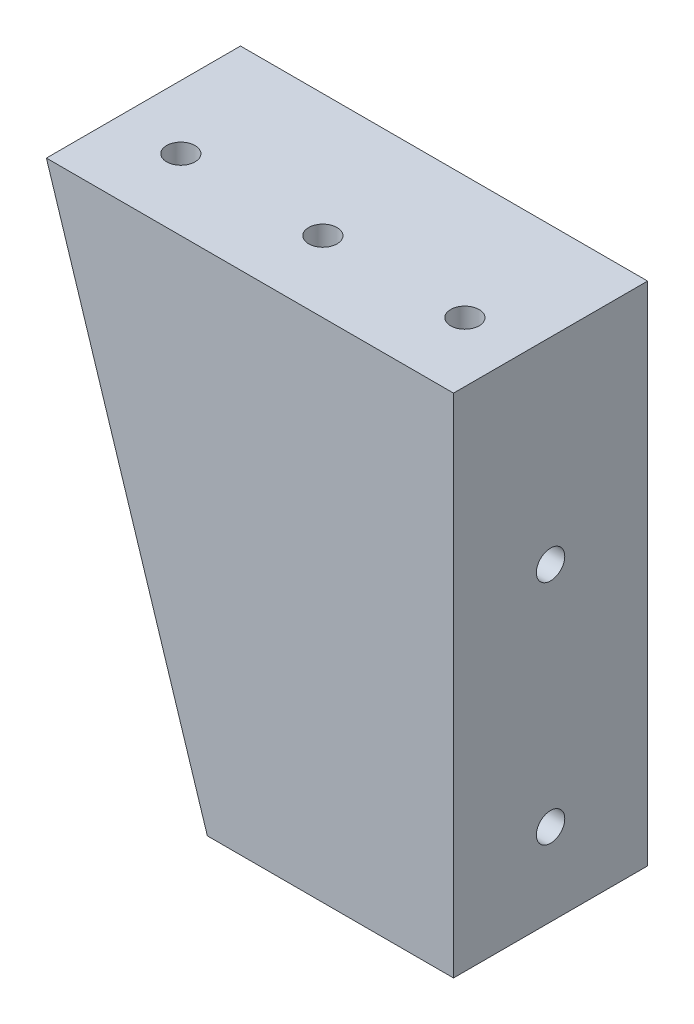
ISO-10303-21;
HEADER;
FILE_DESCRIPTION(('STEP AP214'),'2;1');
FILE_NAME('part.step','',(''),(''),'','','');
FILE_SCHEMA(('AUTOMOTIVE_DESIGN { 1 0 10303 214 1 1 1 1 }'));
ENDSEC;
DATA;
#1=APPLICATION_CONTEXT('core data for automotive mechanical design processes');
#2=APPLICATION_PROTOCOL_DEFINITION('international standard','automotive_design',2000,#1);
#3=PRODUCT_CONTEXT('',#1,'mechanical');
#4=PRODUCT('Part','Part','',(#3));
#5=PRODUCT_RELATED_PRODUCT_CATEGORY('part','',(#4));
#6=PRODUCT_DEFINITION_FORMATION('','',#4);
#7=PRODUCT_DEFINITION_CONTEXT('part definition',#1,'design');
#8=PRODUCT_DEFINITION('design','',#6,#7);
#9=PRODUCT_DEFINITION_SHAPE('','',#8);
#10=(LENGTH_UNIT() NAMED_UNIT(*) SI_UNIT(.MILLI.,.METRE.));
#11=(NAMED_UNIT(*) PLANE_ANGLE_UNIT() SI_UNIT($,.RADIAN.));
#12=(NAMED_UNIT(*) SI_UNIT($,.STERADIAN.) SOLID_ANGLE_UNIT());
#13=UNCERTAINTY_MEASURE_WITH_UNIT(LENGTH_MEASURE(1.E-05),#10,'distance_accuracy_value','');
#14=(GEOMETRIC_REPRESENTATION_CONTEXT(3) GLOBAL_UNCERTAINTY_ASSIGNED_CONTEXT((#13)) GLOBAL_UNIT_ASSIGNED_CONTEXT((#10,
#11,#12)) REPRESENTATION_CONTEXT('',''));
#15=CARTESIAN_POINT('',(0.,0.,0.));
#16=DIRECTION('',(0.,0.,1.));
#17=DIRECTION('',(1.,0.,0.));
#18=AXIS2_PLACEMENT_3D('',#15,#16,#17);
#19=CARTESIAN_POINT('',(371.583669076626,-84.0481083425104,-9.00000000000001));
#20=DIRECTION('',(-1.,0.,0.));
#21=DIRECTION('',(0.,0.,1.));
#22=AXIS2_PLACEMENT_3D('',#19,#20,#21);
#23=PLANE('',#22);
#24=DIRECTION('',(0.,-1.,0.));
#25=VECTOR('',#24,1.);
#26=CARTESIAN_POINT('',(371.583669076626,-84.0481083425104,10.8));
#27=LINE('',#26,#25);
#28=CARTESIAN_POINT('',(371.583669076626,-84.0481083425104,10.8));
#29=VERTEX_POINT('',#28);
#30=CARTESIAN_POINT('',(371.583669076626,-86.4481083425104,10.8));
#31=VERTEX_POINT('',#30);
#32=EDGE_CURVE('E159',#29,#31,#27,.T.);
#33=ORIENTED_EDGE('',*,*,#32,.T.);
#34=DIRECTION('',(0.,0.,1.));
#35=VECTOR('',#34,1.);
#36=CARTESIAN_POINT('',(371.583669076626,-86.4481083425104,-9.00000000000001));
#37=LINE('',#36,#35);
#38=CARTESIAN_POINT('',(371.583669076626,-86.4481083425104,-5.5));
#39=VERTEX_POINT('',#38);
#40=EDGE_CURVE('E145',#39,#31,#37,.T.);
#41=ORIENTED_EDGE('',*,*,#40,.F.);
#42=DIRECTION('',(0.,-1.,0.));
#43=VECTOR('',#42,1.);
#44=CARTESIAN_POINT('',(371.583669076626,0.,-5.5));
#45=LINE('',#44,#43);
#46=CARTESIAN_POINT('',(371.583669076626,-84.0481083425104,-5.5));
#47=VERTEX_POINT('',#46);
#48=EDGE_CURVE('E329',#47,#39,#45,.T.);
#49=ORIENTED_EDGE('',*,*,#48,.F.);
#50=DIRECTION('',(0.,0.,1.));
#51=VECTOR('',#50,1.);
#52=CARTESIAN_POINT('',(371.583669076626,-84.0481083425104,-9.00000000000001));
#53=LINE('',#52,#51);
#54=EDGE_CURVE('E160',#47,#29,#53,.T.);
#55=ORIENTED_EDGE('',*,*,#54,.T.);
#56=EDGE_LOOP('',(#33,#41,#49,#55));
#57=FACE_BOUND('',#56,.T.);
#58=ADVANCED_FACE('F53',(#57),#23,.F.);
#59=CARTESIAN_POINT('',(371.583669076626,-84.0481083425104,-9.00000000000001));
#60=DIRECTION('',(0.,1.,0.));
#61=DIRECTION('',(0.,0.,1.));
#62=AXIS2_PLACEMENT_3D('',#59,#60,#61);
#63=PLANE('',#62);
#64=CARTESIAN_POINT('',(374.406426849265,-84.0481083425104,7.5));
#65=DIRECTION('',(0.,1.,0.));
#66=DIRECTION('',(0.,0.,1.));
#67=AXIS2_PLACEMENT_3D('',#64,#65,#66);
#68=CIRCLE('',#67,1.50000000000002);
#69=CARTESIAN_POINT('',(374.406426849265,-84.0481083425104,9.00000000000002));
#70=VERTEX_POINT('',#69);
#71=EDGE_CURVE('E210',#70,#70,#68,.F.);
#72=ORIENTED_EDGE('',*,*,#71,.F.);
#73=EDGE_LOOP('',(#72));
#74=FACE_BOUND('',#73,.T.);
#75=DIRECTION('',(-1.,0.,0.));
#76=VECTOR('',#75,1.);
#77=CARTESIAN_POINT('',(371.583669076626,-84.0481083425104,10.8));
#78=LINE('',#77,#76);
#79=CARTESIAN_POINT('',(377.083669076626,-84.0481083425104,10.8));
#80=VERTEX_POINT('',#79);
#81=EDGE_CURVE('E69',#80,#29,#78,.T.);
#82=ORIENTED_EDGE('',*,*,#81,.T.);
#83=ORIENTED_EDGE('',*,*,#54,.F.);
#84=DIRECTION('',(-1.,0.,0.));
#85=VECTOR('',#84,1.);
#86=CARTESIAN_POINT('',(0.,-84.0481083425104,-5.5));
#87=LINE('',#86,#85);
#88=CARTESIAN_POINT('',(377.083669076626,-84.0481083425104,-5.5));
#89=VERTEX_POINT('',#88);
#90=EDGE_CURVE('E325',#89,#47,#87,.T.);
#91=ORIENTED_EDGE('',*,*,#90,.F.);
#92=DIRECTION('',(0.,0.,1.));
#93=VECTOR('',#92,1.);
#94=CARTESIAN_POINT('',(377.083669076626,-84.0481083425104,-9.00000000000001));
#95=LINE('',#94,#93);
#96=EDGE_CURVE('E202',#89,#80,#95,.T.);
#97=ORIENTED_EDGE('',*,*,#96,.T.);
#98=EDGE_LOOP('',(#82,#83,#91,#97));
#99=FACE_BOUND('',#98,.T.);
#100=ADVANCED_FACE('F378',(#74,#99),#63,.F.);
#101=CARTESIAN_POINT('',(377.083669076626,-84.0481083425104,-9.00000000000001));
#102=DIRECTION('',(1.,0.,0.));
#103=DIRECTION('',(0.,0.,-1.));
#104=AXIS2_PLACEMENT_3D('',#101,#102,#103);
#105=PLANE('',#104);
#106=DIRECTION('',(0.,1.,0.));
#107=VECTOR('',#106,1.);
#108=CARTESIAN_POINT('',(377.083669076626,-84.0481083425104,10.8));
#109=LINE('',#108,#107);
#110=CARTESIAN_POINT('',(377.083669076626,-86.4481083425104,10.8));
#111=VERTEX_POINT('',#110);
#112=EDGE_CURVE('E77',#111,#80,#109,.T.);
#113=ORIENTED_EDGE('',*,*,#112,.T.);
#114=ORIENTED_EDGE('',*,*,#96,.F.);
#115=DIRECTION('',(0.,1.,0.));
#116=VECTOR('',#115,1.);
#117=CARTESIAN_POINT('',(377.083669076626,0.,-5.5));
#118=LINE('',#117,#116);
#119=CARTESIAN_POINT('',(377.083669076626,-86.4481083425104,-5.5));
#120=VERTEX_POINT('',#119);
#121=EDGE_CURVE('E321',#120,#89,#118,.T.);
#122=ORIENTED_EDGE('',*,*,#121,.F.);
#123=DIRECTION('',(0.,0.,1.));
#124=VECTOR('',#123,1.);
#125=CARTESIAN_POINT('',(377.083669076626,-86.4481083425104,-9.00000000000001));
#126=LINE('',#125,#124);
#127=EDGE_CURVE('E156',#120,#111,#126,.T.);
#128=ORIENTED_EDGE('',*,*,#127,.T.);
#129=EDGE_LOOP('',(#113,#114,#122,#128));
#130=FACE_BOUND('',#129,.T.);
#131=ADVANCED_FACE('F383',(#130),#105,.F.);
#132=CARTESIAN_POINT('',(371.583669076626,-86.4481083425104,-9.00000000000001));
#133=DIRECTION('',(0.,-1.,0.));
#134=DIRECTION('',(0.,0.,-1.));
#135=AXIS2_PLACEMENT_3D('',#132,#133,#134);
#136=PLANE('',#135);
#137=CARTESIAN_POINT('',(374.406426849265,-86.4481083425104,7.5));
#138=DIRECTION('',(0.,-1.,0.));
#139=DIRECTION('',(0.,0.,-1.));
#140=AXIS2_PLACEMENT_3D('',#137,#138,#139);
#141=CIRCLE('',#140,1.50000000000002);
#142=CARTESIAN_POINT('',(374.406426849265,-86.4481083425104,5.99999999999998));
#143=VERTEX_POINT('',#142);
#144=EDGE_CURVE('E189',#143,#143,#141,.F.);
#145=ORIENTED_EDGE('',*,*,#144,.F.);
#146=EDGE_LOOP('',(#145));
#147=FACE_BOUND('',#146,.T.);
#148=DIRECTION('',(1.,0.,0.));
#149=VECTOR('',#148,1.);
#150=CARTESIAN_POINT('',(371.583669076626,-86.4481083425104,10.8));
#151=LINE('',#150,#149);
#152=EDGE_CURVE('E149',#31,#111,#151,.T.);
#153=ORIENTED_EDGE('',*,*,#152,.T.);
#154=ORIENTED_EDGE('',*,*,#127,.F.);
#155=DIRECTION('',(1.,0.,0.));
#156=VECTOR('',#155,1.);
#157=CARTESIAN_POINT('',(0.,-86.4481083425104,-5.5));
#158=LINE('',#157,#156);
#159=EDGE_CURVE('E151',#39,#120,#158,.T.);
#160=ORIENTED_EDGE('',*,*,#159,.F.);
#161=ORIENTED_EDGE('',*,*,#40,.T.);
#162=EDGE_LOOP('',(#153,#154,#160,#161));
#163=FACE_BOUND('',#162,.T.);
#164=ADVANCED_FACE('F147',(#147,#163),#136,.F.);
#165=CARTESIAN_POINT('',(356.512441298202,-84.0481083425104,-9.00000000000001));
#166=DIRECTION('',(-1.,0.,0.));
#167=DIRECTION('',(0.,0.,1.));
#168=AXIS2_PLACEMENT_3D('',#165,#166,#167);
#169=PLANE('',#168);
#170=DIRECTION('',(0.,-1.,0.));
#171=VECTOR('',#170,1.);
#172=CARTESIAN_POINT('',(356.512441298202,-84.0481083425104,10.8));
#173=LINE('',#172,#171);
#174=CARTESIAN_POINT('',(356.512441298202,-84.0481083425104,10.8));
#175=VERTEX_POINT('',#174);
#176=CARTESIAN_POINT('',(356.512441298202,-86.4481083425104,10.8));
#177=VERTEX_POINT('',#176);
#178=EDGE_CURVE('E172',#175,#177,#173,.T.);
#179=ORIENTED_EDGE('',*,*,#178,.T.);
#180=DIRECTION('',(0.,0.,1.));
#181=VECTOR('',#180,1.);
#182=CARTESIAN_POINT('',(356.512441298202,-86.4481083425104,-9.00000000000001));
#183=LINE('',#182,#181);
#184=CARTESIAN_POINT('',(356.512441298202,-86.4481083425104,-5.5));
#185=VERTEX_POINT('',#184);
#186=EDGE_CURVE('E155',#185,#177,#183,.T.);
#187=ORIENTED_EDGE('',*,*,#186,.F.);
#188=DIRECTION('',(0.,-1.,0.));
#189=VECTOR('',#188,1.);
#190=CARTESIAN_POINT('',(356.512441298202,0.,-5.5));
#191=LINE('',#190,#189);
#192=CARTESIAN_POINT('',(356.512441298202,-84.0481083425104,-5.5));
#193=VERTEX_POINT('',#192);
#194=EDGE_CURVE('E12',#193,#185,#191,.T.);
#195=ORIENTED_EDGE('',*,*,#194,.F.);
#196=DIRECTION('',(0.,0.,1.));
#197=VECTOR('',#196,1.);
#198=CARTESIAN_POINT('',(356.512441298202,-84.0481083425104,-9.00000000000001));
#199=LINE('',#198,#197);
#200=EDGE_CURVE('E185',#193,#175,#199,.T.);
#201=ORIENTED_EDGE('',*,*,#200,.T.);
#202=EDGE_LOOP('',(#179,#187,#195,#201));
#203=FACE_BOUND('',#202,.T.);
#204=ADVANCED_FACE('F358',(#203),#169,.F.);
#205=CARTESIAN_POINT('',(356.512441298202,-84.0481083425104,-9.00000000000001));
#206=DIRECTION('',(0.,1.,0.));
#207=DIRECTION('',(0.,0.,1.));
#208=AXIS2_PLACEMENT_3D('',#205,#206,#207);
#209=PLANE('',#208);
#210=CARTESIAN_POINT('',(359.406426849265,-84.0481083425104,7.5));
#211=DIRECTION('',(0.,1.,0.));
#212=DIRECTION('',(0.,0.,1.));
#213=AXIS2_PLACEMENT_3D('',#210,#211,#212);
#214=CIRCLE('',#213,1.50000000000002);
#215=CARTESIAN_POINT('',(359.406426849265,-84.0481083425104,9.00000000000002));
#216=VERTEX_POINT('',#215);
#217=EDGE_CURVE('E218',#216,#216,#214,.F.);
#218=ORIENTED_EDGE('',*,*,#217,.F.);
#219=EDGE_LOOP('',(#218));
#220=FACE_BOUND('',#219,.T.);
#221=DIRECTION('',(-1.,0.,0.));
#222=VECTOR('',#221,1.);
#223=CARTESIAN_POINT('',(356.512441298202,-84.0481083425104,10.8));
#224=LINE('',#223,#222);
#225=CARTESIAN_POINT('',(362.112441298202,-84.0481083425104,10.8));
#226=VERTEX_POINT('',#225);
#227=EDGE_CURVE('E182',#226,#175,#224,.T.);
#228=ORIENTED_EDGE('',*,*,#227,.T.);
#229=ORIENTED_EDGE('',*,*,#200,.F.);
#230=DIRECTION('',(-1.,0.,0.));
#231=VECTOR('',#230,1.);
#232=CARTESIAN_POINT('',(0.,-84.0481083425104,-5.5));
#233=LINE('',#232,#231);
#234=CARTESIAN_POINT('',(362.112441298202,-84.0481083425104,-5.5));
#235=VERTEX_POINT('',#234);
#236=EDGE_CURVE('E62',#235,#193,#233,.T.);
#237=ORIENTED_EDGE('',*,*,#236,.F.);
#238=DIRECTION('',(0.,0.,1.));
#239=VECTOR('',#238,1.);
#240=CARTESIAN_POINT('',(362.112441298202,-84.0481083425104,-9.00000000000001));
#241=LINE('',#240,#239);
#242=EDGE_CURVE('E190',#235,#226,#241,.T.);
#243=ORIENTED_EDGE('',*,*,#242,.T.);
#244=EDGE_LOOP('',(#228,#229,#237,#243));
#245=FACE_BOUND('',#244,.T.);
#246=ADVANCED_FACE('F348',(#220,#245),#209,.F.);
#247=CARTESIAN_POINT('',(362.112441298202,-84.0481083425104,-9.00000000000001));
#248=DIRECTION('',(1.,0.,0.));
#249=DIRECTION('',(0.,1.,0.));
#250=AXIS2_PLACEMENT_3D('',#247,#248,#249);
#251=PLANE('',#250);
#252=DIRECTION('',(0.,1.,0.));
#253=VECTOR('',#252,1.);
#254=CARTESIAN_POINT('',(362.112441298202,-84.0481083425104,10.8));
#255=LINE('',#254,#253);
#256=CARTESIAN_POINT('',(362.112441298202,-86.4481083425104,10.8));
#257=VERTEX_POINT('',#256);
#258=EDGE_CURVE('E179',#257,#226,#255,.T.);
#259=ORIENTED_EDGE('',*,*,#258,.T.);
#260=ORIENTED_EDGE('',*,*,#242,.F.);
#261=DIRECTION('',(0.,1.,0.));
#262=VECTOR('',#261,1.);
#263=CARTESIAN_POINT('',(362.112441298204,-8.37553270484362E-12,-5.5));
#264=LINE('',#263,#262);
#265=CARTESIAN_POINT('',(362.112441298202,-86.4481083425104,-5.5));
#266=VERTEX_POINT('',#265);
#267=EDGE_CURVE('E336',#266,#235,#264,.T.);
#268=ORIENTED_EDGE('',*,*,#267,.F.);
#269=DIRECTION('',(0.,0.,1.));
#270=VECTOR('',#269,1.);
#271=CARTESIAN_POINT('',(362.112441298202,-86.4481083425104,-9.00000000000001));
#272=LINE('',#271,#270);
#273=EDGE_CURVE('E194',#266,#257,#272,.T.);
#274=ORIENTED_EDGE('',*,*,#273,.T.);
#275=EDGE_LOOP('',(#259,#260,#268,#274));
#276=FACE_BOUND('',#275,.T.);
#277=ADVANCED_FACE('F351',(#276),#251,.F.);
#278=CARTESIAN_POINT('',(356.512441298202,-86.4481083425104,-9.00000000000001));
#279=DIRECTION('',(0.,-1.,0.));
#280=DIRECTION('',(1.,0.,0.));
#281=AXIS2_PLACEMENT_3D('',#278,#279,#280);
#282=PLANE('',#281);
#283=CARTESIAN_POINT('',(359.406426849265,-86.4481083425104,7.5));
#284=DIRECTION('',(0.,-1.,0.));
#285=DIRECTION('',(1.,0.,0.));
#286=AXIS2_PLACEMENT_3D('',#283,#284,#285);
#287=CIRCLE('',#286,1.50000000000002);
#288=CARTESIAN_POINT('',(360.906426849265,-86.4481083425104,7.5));
#289=VERTEX_POINT('',#288);
#290=EDGE_CURVE('E214',#289,#289,#287,.F.);
#291=ORIENTED_EDGE('',*,*,#290,.F.);
#292=EDGE_LOOP('',(#291));
#293=FACE_BOUND('',#292,.T.);
#294=DIRECTION('',(1.,0.,0.));
#295=VECTOR('',#294,1.);
#296=CARTESIAN_POINT('',(356.512441298202,-86.4481083425104,10.8));
#297=LINE('',#296,#295);
#298=EDGE_CURVE('E176',#177,#257,#297,.T.);
#299=ORIENTED_EDGE('',*,*,#298,.T.);
#300=ORIENTED_EDGE('',*,*,#273,.F.);
#301=DIRECTION('',(1.,0.,0.));
#302=VECTOR('',#301,1.);
#303=CARTESIAN_POINT('',(2.14233661422201E-13,-86.4481083425113,-5.5));
#304=LINE('',#303,#302);
#305=EDGE_CURVE('E332',#185,#266,#304,.T.);
#306=ORIENTED_EDGE('',*,*,#305,.F.);
#307=ORIENTED_EDGE('',*,*,#186,.T.);
#308=EDGE_LOOP('',(#299,#300,#306,#307));
#309=FACE_BOUND('',#308,.T.);
#310=ADVANCED_FACE('F361',(#293,#309),#282,.F.);
#311=CARTESIAN_POINT('',(374.406426849265,-85.5128405871344,7.5));
#312=DIRECTION('',(0.,1.,0.));
#313=DIRECTION('',(0.,0.,1.));
#314=AXIS2_PLACEMENT_3D('',#311,#312,#313);
#315=CYLINDRICAL_SURFACE('',#314,1.50000000000002);
#316=ORIENTED_EDGE('',*,*,#71,.T.);
#317=EDGE_LOOP('',(#316));
#318=FACE_BOUND('',#317,.T.);
#319=CARTESIAN_POINT('',(374.406426849265,-77.5128405871344,7.5));
#320=DIRECTION('',(0.,1.,0.));
#321=DIRECTION('',(0.,0.,1.));
#322=AXIS2_PLACEMENT_3D('',#319,#320,#321);
#323=CIRCLE('',#322,1.50000000000002);
#324=CARTESIAN_POINT('',(374.406426849265,-77.5128405871344,9.00000000000002));
#325=VERTEX_POINT('',#324);
#326=EDGE_CURVE('E278',#325,#325,#323,.T.);
#327=ORIENTED_EDGE('',*,*,#326,.T.);
#328=EDGE_LOOP('',(#327));
#329=FACE_BOUND('',#328,.T.);
#330=ADVANCED_FACE('F363',(#318,#329),#315,.F.);
#331=CARTESIAN_POINT('',(359.406426849265,-85.5128405871344,7.5));
#332=DIRECTION('',(0.,1.,0.));
#333=DIRECTION('',(0.,0.,1.));
#334=AXIS2_PLACEMENT_3D('',#331,#332,#333);
#335=CYLINDRICAL_SURFACE('',#334,1.50000000000002);
#336=ORIENTED_EDGE('',*,*,#217,.T.);
#337=EDGE_LOOP('',(#336));
#338=FACE_BOUND('',#337,.T.);
#339=CARTESIAN_POINT('',(359.406426849265,-77.5128405871344,7.5));
#340=DIRECTION('',(0.,1.,0.));
#341=DIRECTION('',(0.,0.,1.));
#342=AXIS2_PLACEMENT_3D('',#339,#340,#341);
#343=CIRCLE('',#342,1.50000000000002);
#344=CARTESIAN_POINT('',(359.406426849265,-77.5128405871344,9.00000000000002));
#345=VERTEX_POINT('',#344);
#346=EDGE_CURVE('E288',#345,#345,#343,.T.);
#347=ORIENTED_EDGE('',*,*,#346,.T.);
#348=EDGE_LOOP('',(#347));
#349=FACE_BOUND('',#348,.T.);
#350=ADVANCED_FACE('F370',(#338,#349),#335,.F.);
#351=CARTESIAN_POINT('',(380.706426849265,-77.5128405871344,15.));
#352=DIRECTION('',(0.,-1.,0.));
#353=DIRECTION('',(0.,0.,-1.));
#354=AXIS2_PLACEMENT_3D('',#351,#352,#353);
#355=PLANE('',#354);
#356=CARTESIAN_POINT('',(344.406426849265,-77.5128405871344,7.5));
#357=DIRECTION('',(0.,1.,0.));
#358=DIRECTION('',(0.,0.,1.));
#359=AXIS2_PLACEMENT_3D('',#356,#357,#358);
#360=CIRCLE('',#359,1.50000000000002);
#361=CARTESIAN_POINT('',(344.406426849265,-77.5128405871344,9.00000000000002));
#362=VERTEX_POINT('',#361);
#363=EDGE_CURVE('E284',#362,#362,#360,.T.);
#364=ORIENTED_EDGE('',*,*,#363,.F.);
#365=EDGE_LOOP('',(#364));
#366=FACE_BOUND('',#365,.T.);
#367=ORIENTED_EDGE('',*,*,#346,.F.);
#368=EDGE_LOOP('',(#367));
#369=FACE_BOUND('',#368,.T.);
#370=ORIENTED_EDGE('',*,*,#326,.F.);
#371=EDGE_LOOP('',(#370));
#372=FACE_BOUND('',#371,.T.);
#373=DIRECTION('',(0.,0.,-1.));
#374=VECTOR('',#373,1.);
#375=CARTESIAN_POINT('',(380.706426849265,-77.5128405871344,15.));
#376=LINE('',#375,#374);
#377=CARTESIAN_POINT('',(380.706426849265,-77.5128405871344,15.));
#378=VERTEX_POINT('',#377);
#379=CARTESIAN_POINT('',(380.706426849265,-77.5128405871344,-5.5));
#380=VERTEX_POINT('',#379);
#381=EDGE_CURVE('E307',#378,#380,#376,.T.);
#382=ORIENTED_EDGE('',*,*,#381,.T.);
#383=DIRECTION('',(1.,0.,0.));
#384=VECTOR('',#383,1.);
#385=CARTESIAN_POINT('',(380.706426849265,-77.5128405871344,-5.5));
#386=LINE('',#385,#384);
#387=CARTESIAN_POINT('',(337.706426849265,-77.5128405871344,-5.5));
#388=VERTEX_POINT('',#387);
#389=EDGE_CURVE('E274',#388,#380,#386,.T.);
#390=ORIENTED_EDGE('',*,*,#389,.F.);
#391=DIRECTION('',(0.,0.,-1.));
#392=VECTOR('',#391,1.);
#393=CARTESIAN_POINT('',(337.706426849265,-77.5128405871344,15.));
#394=LINE('',#393,#392);
#395=CARTESIAN_POINT('',(337.706426849265,-77.5128405871344,15.));
#396=VERTEX_POINT('',#395);
#397=EDGE_CURVE('E316',#396,#388,#394,.T.);
#398=ORIENTED_EDGE('',*,*,#397,.F.);
#399=DIRECTION('',(-1.,0.,0.));
#400=VECTOR('',#399,1.);
#401=CARTESIAN_POINT('',(380.706426849265,-77.5128405871344,15.));
#402=LINE('',#401,#400);
#403=EDGE_CURVE('E283',#378,#396,#402,.T.);
#404=ORIENTED_EDGE('',*,*,#403,.F.);
#405=EDGE_LOOP('',(#382,#390,#398,#404));
#406=FACE_BOUND('',#405,.T.);
#407=ADVANCED_FACE('F55',(#366,#369,#372,#406),#355,.F.);
#408=CARTESIAN_POINT('',(337.706426849265,-77.5128405871344,15.));
#409=DIRECTION('',(0.953042685805767,0.302835993620524,0.));
#410=DIRECTION('',(-0.302835993620524,0.953042685805767,0.));
#411=AXIS2_PLACEMENT_3D('',#408,#409,#410);
#412=PLANE('',#411);
#413=ORIENTED_EDGE('',*,*,#397,.T.);
#414=DIRECTION('',(-0.302835993620523,0.953042685805767,0.));
#415=VECTOR('',#414,1.);
#416=CARTESIAN_POINT('',(337.706426849265,-77.5128405871344,-5.5));
#417=LINE('',#416,#415);
#418=CARTESIAN_POINT('',(354.706426849265,-131.012840587134,-5.5));
#419=VERTEX_POINT('',#418);
#420=EDGE_CURVE('E270',#419,#388,#417,.T.);
#421=ORIENTED_EDGE('',*,*,#420,.F.);
#422=DIRECTION('',(0.,0.,-1.));
#423=VECTOR('',#422,1.);
#424=CARTESIAN_POINT('',(354.706426849265,-131.012840587134,15.));
#425=LINE('',#424,#423);
#426=CARTESIAN_POINT('',(354.706426849265,-131.012840587134,15.));
#427=VERTEX_POINT('',#426);
#428=EDGE_CURVE('E313',#427,#419,#425,.T.);
#429=ORIENTED_EDGE('',*,*,#428,.F.);
#430=DIRECTION('',(0.302835993620523,-0.953042685805767,0.));
#431=VECTOR('',#430,1.);
#432=CARTESIAN_POINT('',(337.706426849265,-77.5128405871344,15.));
#433=LINE('',#432,#431);
#434=EDGE_CURVE('E298',#396,#427,#433,.T.);
#435=ORIENTED_EDGE('',*,*,#434,.F.);
#436=EDGE_LOOP('',(#413,#421,#429,#435));
#437=FACE_BOUND('',#436,.T.);
#438=ADVANCED_FACE('F458',(#437),#412,.F.);
#439=CARTESIAN_POINT('',(380.706426849265,-131.012840587134,15.));
#440=DIRECTION('',(0.,1.,0.));
#441=DIRECTION('',(0.,0.,1.));
#442=AXIS2_PLACEMENT_3D('',#439,#440,#441);
#443=PLANE('',#442);
#444=CARTESIAN_POINT('',(373.706426849265,-131.012840587134,4.75));
#445=DIRECTION('',(0.,-1.,0.));
#446=DIRECTION('',(0.,0.,-1.));
#447=AXIS2_PLACEMENT_3D('',#444,#445,#446);
#448=CIRCLE('',#447,1.50000000000002);
#449=CARTESIAN_POINT('',(373.706426849265,-131.012840587134,3.24999999999998));
#450=VERTEX_POINT('',#449);
#451=EDGE_CURVE('E236',#450,#450,#448,.T.);
#452=ORIENTED_EDGE('',*,*,#451,.F.);
#453=EDGE_LOOP('',(#452));
#454=FACE_BOUND('',#453,.T.);
#455=CARTESIAN_POINT('',(361.706426849265,-131.012840587134,4.75));
#456=DIRECTION('',(0.,-1.,0.));
#457=DIRECTION('',(0.,0.,-1.));
#458=AXIS2_PLACEMENT_3D('',#455,#456,#457);
#459=CIRCLE('',#458,1.50000000000002);
#460=CARTESIAN_POINT('',(361.706426849265,-131.012840587134,3.24999999999998));
#461=VERTEX_POINT('',#460);
#462=EDGE_CURVE('E227',#461,#461,#459,.T.);
#463=ORIENTED_EDGE('',*,*,#462,.F.);
#464=EDGE_LOOP('',(#463));
#465=FACE_BOUND('',#464,.T.);
#466=ORIENTED_EDGE('',*,*,#428,.T.);
#467=DIRECTION('',(-1.,0.,0.));
#468=VECTOR('',#467,1.);
#469=CARTESIAN_POINT('',(354.706426849265,-131.012840587134,-5.5));
#470=LINE('',#469,#468);
#471=CARTESIAN_POINT('',(380.706426849265,-131.012840587134,-5.5));
#472=VERTEX_POINT('',#471);
#473=EDGE_CURVE('E266',#472,#419,#470,.T.);
#474=ORIENTED_EDGE('',*,*,#473,.F.);
#475=DIRECTION('',(0.,0.,-1.));
#476=VECTOR('',#475,1.);
#477=CARTESIAN_POINT('',(380.706426849265,-131.012840587134,15.));
#478=LINE('',#477,#476);
#479=CARTESIAN_POINT('',(380.706426849265,-131.012840587134,15.));
#480=VERTEX_POINT('',#479);
#481=EDGE_CURVE('E310',#480,#472,#478,.T.);
#482=ORIENTED_EDGE('',*,*,#481,.F.);
#483=DIRECTION('',(1.,0.,0.));
#484=VECTOR('',#483,1.);
#485=CARTESIAN_POINT('',(380.706426849265,-131.012840587134,15.));
#486=LINE('',#485,#484);
#487=EDGE_CURVE('E301',#427,#480,#486,.T.);
#488=ORIENTED_EDGE('',*,*,#487,.F.);
#489=EDGE_LOOP('',(#466,#474,#482,#488));
#490=FACE_BOUND('',#489,.T.);
#491=ADVANCED_FACE('F455',(#454,#465,#490),#443,.F.);
#492=CARTESIAN_POINT('',(380.706426849265,-77.5128405871344,15.));
#493=DIRECTION('',(-1.,0.,0.));
#494=DIRECTION('',(0.,0.,1.));
#495=AXIS2_PLACEMENT_3D('',#492,#493,#494);
#496=PLANE('',#495);
#497=CARTESIAN_POINT('',(380.706426849265,-98.3128405871344,4.75));
#498=DIRECTION('',(1.,0.,0.));
#499=DIRECTION('',(0.,0.,-1.));
#500=AXIS2_PLACEMENT_3D('',#497,#498,#499);
#501=CIRCLE('',#500,1.5);
#502=CARTESIAN_POINT('',(380.706426849265,-98.3128405871344,3.25));
#503=VERTEX_POINT('',#502);
#504=EDGE_CURVE('E252',#503,#503,#501,.T.);
#505=ORIENTED_EDGE('',*,*,#504,.F.);
#506=EDGE_LOOP('',(#505));
#507=FACE_BOUND('',#506,.T.);
#508=CARTESIAN_POINT('',(380.706426849265,-122.312840587134,4.75));
#509=DIRECTION('',(1.,0.,0.));
#510=DIRECTION('',(0.,0.,-1.));
#511=AXIS2_PLACEMENT_3D('',#508,#509,#510);
#512=CIRCLE('',#511,1.5);
#513=CARTESIAN_POINT('',(380.706426849265,-122.312840587134,3.25));
#514=VERTEX_POINT('',#513);
#515=EDGE_CURVE('E256',#514,#514,#512,.T.);
#516=ORIENTED_EDGE('',*,*,#515,.F.);
#517=EDGE_LOOP('',(#516));
#518=FACE_BOUND('',#517,.T.);
#519=ORIENTED_EDGE('',*,*,#481,.T.);
#520=DIRECTION('',(0.,-1.,0.));
#521=VECTOR('',#520,1.);
#522=CARTESIAN_POINT('',(380.706426849265,-131.012840587134,-5.5));
#523=LINE('',#522,#521);
#524=EDGE_CURVE('E251',#380,#472,#523,.T.);
#525=ORIENTED_EDGE('',*,*,#524,.F.);
#526=ORIENTED_EDGE('',*,*,#381,.F.);
#527=DIRECTION('',(0.,1.,0.));
#528=VECTOR('',#527,1.);
#529=CARTESIAN_POINT('',(380.706426849265,-77.5128405871344,15.));
#530=LINE('',#529,#528);
#531=EDGE_CURVE('E304',#480,#378,#530,.T.);
#532=ORIENTED_EDGE('',*,*,#531,.F.);
#533=EDGE_LOOP('',(#519,#525,#526,#532));
#534=FACE_BOUND('',#533,.T.);
#535=ADVANCED_FACE('F451',(#507,#518,#534),#496,.F.);
#536=CARTESIAN_POINT('',(0.,0.,15.));
#537=DIRECTION('',(0.,0.,1.));
#538=DIRECTION('',(1.,0.,0.));
#539=AXIS2_PLACEMENT_3D('',#536,#537,#538);
#540=PLANE('',#539);
#541=ORIENTED_EDGE('',*,*,#403,.T.);
#542=ORIENTED_EDGE('',*,*,#434,.T.);
#543=ORIENTED_EDGE('',*,*,#487,.T.);
#544=ORIENTED_EDGE('',*,*,#531,.T.);
#545=EDGE_LOOP('',(#541,#542,#543,#544));
#546=FACE_BOUND('',#545,.T.);
#547=ADVANCED_FACE('F442',(#546),#540,.T.);
#548=CARTESIAN_POINT('',(344.406426849265,-85.5128405871344,7.5));
#549=DIRECTION('',(0.,1.,0.));
#550=DIRECTION('',(0.,0.,1.));
#551=AXIS2_PLACEMENT_3D('',#548,#549,#550);
#552=CYLINDRICAL_SURFACE('',#551,1.50000000000002);
#553=CARTESIAN_POINT('',(344.406426849265,-85.5128405871344,7.5));
#554=DIRECTION('',(0.,1.,0.));
#555=DIRECTION('',(0.,0.,1.));
#556=AXIS2_PLACEMENT_3D('',#553,#554,#555);
#557=CIRCLE('',#556,1.50000000000002);
#558=CARTESIAN_POINT('',(344.406426849265,-85.5128405871344,9.00000000000002));
#559=VERTEX_POINT('',#558);
#560=EDGE_CURVE('E279',#559,#559,#557,.T.);
#561=ORIENTED_EDGE('',*,*,#560,.F.);
#562=EDGE_LOOP('',(#561));
#563=FACE_BOUND('',#562,.T.);
#564=ORIENTED_EDGE('',*,*,#363,.T.);
#565=EDGE_LOOP('',(#564));
#566=FACE_BOUND('',#565,.T.);
#567=ADVANCED_FACE('F438',(#563,#566),#552,.F.);
#568=CARTESIAN_POINT('',(0.,-85.5128405871344,0.));
#569=DIRECTION('',(0.,1.,0.));
#570=DIRECTION('',(0.,0.,1.));
#571=AXIS2_PLACEMENT_3D('',#568,#569,#570);
#572=PLANE('',#571);
#573=ORIENTED_EDGE('',*,*,#560,.T.);
#574=EDGE_LOOP('',(#573));
#575=FACE_BOUND('',#574,.T.);
#576=ADVANCED_FACE('F435',(#575),#572,.T.);
#577=CARTESIAN_POINT('',(0.,0.,-5.5));
#578=DIRECTION('',(0.,0.,1.));
#579=DIRECTION('',(1.,0.,0.));
#580=AXIS2_PLACEMENT_3D('',#577,#578,#579);
#581=PLANE('',#580);
#582=ORIENTED_EDGE('',*,*,#236,.T.);
#583=ORIENTED_EDGE('',*,*,#194,.T.);
#584=ORIENTED_EDGE('',*,*,#305,.T.);
#585=ORIENTED_EDGE('',*,*,#267,.T.);
#586=EDGE_LOOP('',(#582,#583,#584,#585));
#587=FACE_BOUND('',#586,.T.);
#588=ORIENTED_EDGE('',*,*,#90,.T.);
#589=ORIENTED_EDGE('',*,*,#48,.T.);
#590=ORIENTED_EDGE('',*,*,#159,.T.);
#591=ORIENTED_EDGE('',*,*,#121,.T.);
#592=EDGE_LOOP('',(#588,#589,#590,#591));
#593=FACE_BOUND('',#592,.T.);
#594=ORIENTED_EDGE('',*,*,#524,.T.);
#595=ORIENTED_EDGE('',*,*,#473,.T.);
#596=ORIENTED_EDGE('',*,*,#420,.T.);
#597=ORIENTED_EDGE('',*,*,#389,.T.);
#598=EDGE_LOOP('',(#594,#595,#596,#597));
#599=FACE_BOUND('',#598,.T.);
#600=ADVANCED_FACE('F342',(#587,#593,#599),#581,.F.);
#601=CARTESIAN_POINT('',(370.706426849265,-122.312840587134,4.75));
#602=DIRECTION('',(1.,0.,0.));
#603=DIRECTION('',(0.,0.,-1.));
#604=AXIS2_PLACEMENT_3D('',#601,#602,#603);
#605=CYLINDRICAL_SURFACE('',#604,1.5);
#606=ORIENTED_EDGE('',*,*,#515,.T.);
#607=EDGE_LOOP('',(#606));
#608=FACE_BOUND('',#607,.T.);
#609=CARTESIAN_POINT('',(370.706426849265,-122.312840587134,4.75));
#610=DIRECTION('',(1.,0.,0.));
#611=DIRECTION('',(0.,0.,-1.));
#612=AXIS2_PLACEMENT_3D('',#609,#610,#611);
#613=CIRCLE('',#612,1.5);
#614=CARTESIAN_POINT('',(370.706426849265,-122.312840587134,3.25));
#615=VERTEX_POINT('',#614);
#616=EDGE_CURVE('E235',#615,#615,#613,.T.);
#617=ORIENTED_EDGE('',*,*,#616,.F.);
#618=EDGE_LOOP('',(#617));
#619=FACE_BOUND('',#618,.T.);
#620=ADVANCED_FACE('F426',(#608,#619),#605,.F.);
#621=CARTESIAN_POINT('',(370.706426849265,0.,0.));
#622=DIRECTION('',(1.,0.,0.));
#623=DIRECTION('',(0.,0.,-1.));
#624=AXIS2_PLACEMENT_3D('',#621,#622,#623);
#625=PLANE('',#624);
#626=ORIENTED_EDGE('',*,*,#616,.T.);
#627=EDGE_LOOP('',(#626));
#628=FACE_BOUND('',#627,.T.);
#629=ADVANCED_FACE('F424',(#628),#625,.T.);
#630=CARTESIAN_POINT('',(370.706426849265,-98.3128405871344,4.75));
#631=DIRECTION('',(1.,0.,0.));
#632=DIRECTION('',(0.,0.,-1.));
#633=AXIS2_PLACEMENT_3D('',#630,#631,#632);
#634=CYLINDRICAL_SURFACE('',#633,1.5);
#635=CARTESIAN_POINT('',(370.706426849265,-98.3128405871344,4.75));
#636=DIRECTION('',(1.,0.,0.));
#637=DIRECTION('',(0.,0.,-1.));
#638=AXIS2_PLACEMENT_3D('',#635,#636,#637);
#639=CIRCLE('',#638,1.5);
#640=CARTESIAN_POINT('',(370.706426849265,-98.3128405871344,3.25));
#641=VERTEX_POINT('',#640);
#642=EDGE_CURVE('E247',#641,#641,#639,.T.);
#643=ORIENTED_EDGE('',*,*,#642,.F.);
#644=EDGE_LOOP('',(#643));
#645=FACE_BOUND('',#644,.T.);
#646=ORIENTED_EDGE('',*,*,#504,.T.);
#647=EDGE_LOOP('',(#646));
#648=FACE_BOUND('',#647,.T.);
#649=ADVANCED_FACE('F420',(#645,#648),#634,.F.);
#650=CARTESIAN_POINT('',(370.706426849265,0.,0.));
#651=DIRECTION('',(1.,0.,0.));
#652=DIRECTION('',(0.,0.,-1.));
#653=AXIS2_PLACEMENT_3D('',#650,#651,#652);
#654=PLANE('',#653);
#655=ORIENTED_EDGE('',*,*,#642,.T.);
#656=EDGE_LOOP('',(#655));
#657=FACE_BOUND('',#656,.T.);
#658=ADVANCED_FACE('F416',(#657),#654,.T.);
#659=CARTESIAN_POINT('',(361.706426849265,-124.012840587134,4.75));
#660=DIRECTION('',(0.,-1.,0.));
#661=DIRECTION('',(0.,0.,-1.));
#662=AXIS2_PLACEMENT_3D('',#659,#660,#661);
#663=CYLINDRICAL_SURFACE('',#662,1.50000000000002);
#664=CARTESIAN_POINT('',(361.706426849265,-124.012840587134,4.75));
#665=DIRECTION('',(0.,-1.,0.));
#666=DIRECTION('',(0.,0.,-1.));
#667=AXIS2_PLACEMENT_3D('',#664,#665,#666);
#668=CIRCLE('',#667,1.50000000000002);
#669=CARTESIAN_POINT('',(361.706426849265,-124.012840587134,3.24999999999998));
#670=VERTEX_POINT('',#669);
#671=EDGE_CURVE('E240',#670,#670,#668,.T.);
#672=ORIENTED_EDGE('',*,*,#671,.F.);
#673=EDGE_LOOP('',(#672));
#674=FACE_BOUND('',#673,.T.);
#675=ORIENTED_EDGE('',*,*,#462,.T.);
#676=EDGE_LOOP('',(#675));
#677=FACE_BOUND('',#676,.T.);
#678=ADVANCED_FACE('F412',(#674,#677),#663,.F.);
#679=CARTESIAN_POINT('',(0.,-124.012840587134,0.));
#680=DIRECTION('',(0.,-1.,0.));
#681=DIRECTION('',(0.,0.,-1.));
#682=AXIS2_PLACEMENT_3D('',#679,#680,#681);
#683=PLANE('',#682);
#684=ORIENTED_EDGE('',*,*,#671,.T.);
#685=EDGE_LOOP('',(#684));
#686=FACE_BOUND('',#685,.T.);
#687=ADVANCED_FACE('F408',(#686),#683,.T.);
#688=CARTESIAN_POINT('',(373.706426849265,-124.012840587134,4.75));
#689=DIRECTION('',(0.,-1.,0.));
#690=DIRECTION('',(0.,0.,-1.));
#691=AXIS2_PLACEMENT_3D('',#688,#689,#690);
#692=CYLINDRICAL_SURFACE('',#691,1.50000000000002);
#693=CARTESIAN_POINT('',(373.706426849265,-124.012840587134,4.75));
#694=DIRECTION('',(0.,-1.,0.));
#695=DIRECTION('',(0.,0.,-1.));
#696=AXIS2_PLACEMENT_3D('',#693,#694,#695);
#697=CIRCLE('',#696,1.50000000000002);
#698=CARTESIAN_POINT('',(373.706426849265,-124.012840587134,3.24999999999998));
#699=VERTEX_POINT('',#698);
#700=EDGE_CURVE('E231',#699,#699,#697,.T.);
#701=ORIENTED_EDGE('',*,*,#700,.F.);
#702=EDGE_LOOP('',(#701));
#703=FACE_BOUND('',#702,.T.);
#704=ORIENTED_EDGE('',*,*,#451,.T.);
#705=EDGE_LOOP('',(#704));
#706=FACE_BOUND('',#705,.T.);
#707=ADVANCED_FACE('F404',(#703,#706),#692,.F.);
#708=CARTESIAN_POINT('',(0.,-124.012840587134,0.));
#709=DIRECTION('',(0.,-1.,0.));
#710=DIRECTION('',(0.,0.,-1.));
#711=AXIS2_PLACEMENT_3D('',#708,#709,#710);
#712=PLANE('',#711);
#713=ORIENTED_EDGE('',*,*,#700,.T.);
#714=EDGE_LOOP('',(#713));
#715=FACE_BOUND('',#714,.T.);
#716=ADVANCED_FACE('F396',(#715),#712,.T.);
#717=CARTESIAN_POINT('',(0.,-87.5128405871344,0.));
#718=DIRECTION('',(0.,1.,0.));
#719=DIRECTION('',(0.,0.,1.));
#720=AXIS2_PLACEMENT_3D('',#717,#718,#719);
#721=PLANE('',#720);
#722=CARTESIAN_POINT('',(359.406426849265,-87.5128405871344,7.5));
#723=DIRECTION('',(0.,1.,0.));
#724=DIRECTION('',(0.,0.,1.));
#725=AXIS2_PLACEMENT_3D('',#722,#723,#724);
#726=CIRCLE('',#725,1.50000000000002);
#727=CARTESIAN_POINT('',(359.406426849265,-87.5128405871344,9.00000000000002));
#728=VERTEX_POINT('',#727);
#729=EDGE_CURVE('E223',#728,#728,#726,.T.);
#730=ORIENTED_EDGE('',*,*,#729,.T.);
#731=EDGE_LOOP('',(#730));
#732=FACE_BOUND('',#731,.T.);
#733=ADVANCED_FACE('F392',(#732),#721,.T.);
#734=ORIENTED_EDGE('',*,*,#290,.T.);
#735=EDGE_LOOP('',(#734));
#736=FACE_BOUND('',#735,.T.);
#737=ORIENTED_EDGE('',*,*,#729,.F.);
#738=EDGE_LOOP('',(#737));
#739=FACE_BOUND('',#738,.T.);
#740=ADVANCED_FACE('F395',(#736,#739),#335,.F.);
#741=CARTESIAN_POINT('',(0.,-87.5128405871344,0.));
#742=DIRECTION('',(0.,1.,0.));
#743=DIRECTION('',(0.,0.,1.));
#744=AXIS2_PLACEMENT_3D('',#741,#742,#743);
#745=PLANE('',#744);
#746=CARTESIAN_POINT('',(374.406426849265,-87.5128405871344,7.5));
#747=DIRECTION('',(0.,1.,0.));
#748=DIRECTION('',(0.,0.,1.));
#749=AXIS2_PLACEMENT_3D('',#746,#747,#748);
#750=CIRCLE('',#749,1.50000000000002);
#751=CARTESIAN_POINT('',(374.406426849265,-87.5128405871344,9.00000000000002));
#752=VERTEX_POINT('',#751);
#753=EDGE_CURVE('E222',#752,#752,#750,.T.);
#754=ORIENTED_EDGE('',*,*,#753,.T.);
#755=EDGE_LOOP('',(#754));
#756=FACE_BOUND('',#755,.T.);
#757=ADVANCED_FACE('F398',(#756),#745,.T.);
#758=ORIENTED_EDGE('',*,*,#144,.T.);
#759=EDGE_LOOP('',(#758));
#760=FACE_BOUND('',#759,.T.);
#761=ORIENTED_EDGE('',*,*,#753,.F.);
#762=EDGE_LOOP('',(#761));
#763=FACE_BOUND('',#762,.T.);
#764=ADVANCED_FACE('F373',(#760,#763),#315,.F.);
#765=CARTESIAN_POINT('',(0.,0.,10.8));
#766=DIRECTION('',(0.,0.,1.));
#767=DIRECTION('',(1.,0.,0.));
#768=AXIS2_PLACEMENT_3D('',#765,#766,#767);
#769=PLANE('',#768);
#770=ORIENTED_EDGE('',*,*,#178,.F.);
#771=ORIENTED_EDGE('',*,*,#227,.F.);
#772=ORIENTED_EDGE('',*,*,#258,.F.);
#773=ORIENTED_EDGE('',*,*,#298,.F.);
#774=EDGE_LOOP('',(#770,#771,#772,#773));
#775=FACE_BOUND('',#774,.T.);
#776=ADVANCED_FACE('F356',(#775),#769,.F.);
#777=CARTESIAN_POINT('',(0.,0.,10.8));
#778=DIRECTION('',(0.,0.,1.));
#779=DIRECTION('',(1.,0.,0.));
#780=AXIS2_PLACEMENT_3D('',#777,#778,#779);
#781=PLANE('',#780);
#782=ORIENTED_EDGE('',*,*,#32,.F.);
#783=ORIENTED_EDGE('',*,*,#81,.F.);
#784=ORIENTED_EDGE('',*,*,#112,.F.);
#785=ORIENTED_EDGE('',*,*,#152,.F.);
#786=EDGE_LOOP('',(#782,#783,#784,#785));
#787=FACE_BOUND('',#786,.T.);
#788=ADVANCED_FACE('F164',(#787),#781,.F.);
#789=CLOSED_SHELL('',(#58,#100,#131,#164,#204,#246,#277,#310,#330,#350,#407,#438,#491,#535,#547,
#567,#576,#600,#620,#629,#649,#658,#678,#687,#707,#716,#733,#740,#757,#764,#776,#788));
#790=MANIFOLD_SOLID_BREP('B2',#789);
#791=ADVANCED_BREP_SHAPE_REPRESENTATION('',(#18,#790),#14);
#792=SHAPE_DEFINITION_REPRESENTATION(#9,#791);
ENDSEC;
END-ISO-10303-21;
